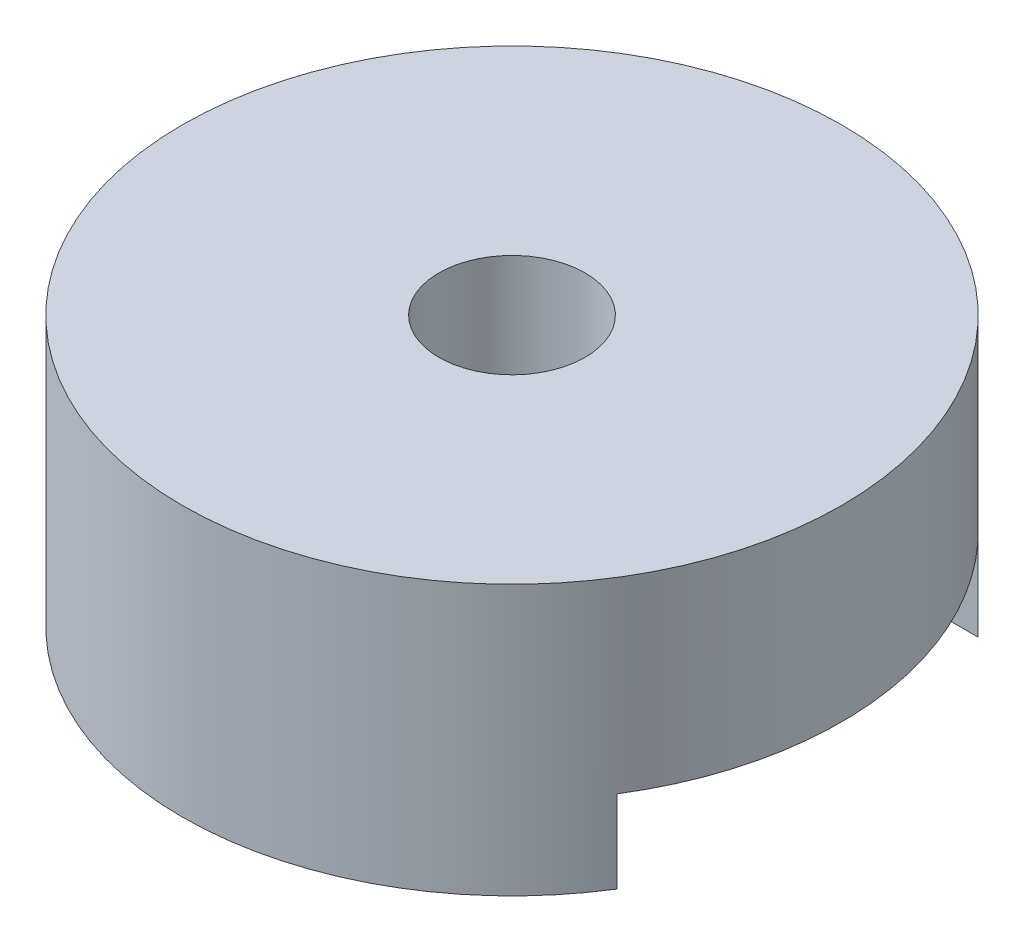
ISO-10303-21;
HEADER;
FILE_DESCRIPTION(('STEP AP214'),'2;1');
FILE_NAME('part.step','',(''),(''),'','','');
FILE_SCHEMA(('AUTOMOTIVE_DESIGN { 1 0 10303 214 1 1 1 1 }'));
ENDSEC;
DATA;
#1=APPLICATION_CONTEXT('core data for automotive mechanical design processes');
#2=APPLICATION_PROTOCOL_DEFINITION('international standard','automotive_design',2000,#1);
#3=PRODUCT_CONTEXT('',#1,'mechanical');
#4=PRODUCT('Part','Part','',(#3));
#5=PRODUCT_RELATED_PRODUCT_CATEGORY('part','',(#4));
#6=PRODUCT_DEFINITION_FORMATION('','',#4);
#7=PRODUCT_DEFINITION_CONTEXT('part definition',#1,'design');
#8=PRODUCT_DEFINITION('design','',#6,#7);
#9=PRODUCT_DEFINITION_SHAPE('','',#8);
#10=(LENGTH_UNIT() NAMED_UNIT(*) SI_UNIT(.MILLI.,.METRE.));
#11=(NAMED_UNIT(*) PLANE_ANGLE_UNIT() SI_UNIT($,.RADIAN.));
#12=(NAMED_UNIT(*) SI_UNIT($,.STERADIAN.) SOLID_ANGLE_UNIT());
#13=UNCERTAINTY_MEASURE_WITH_UNIT(LENGTH_MEASURE(1.E-05),#10,'distance_accuracy_value','');
#14=(GEOMETRIC_REPRESENTATION_CONTEXT(3) GLOBAL_UNCERTAINTY_ASSIGNED_CONTEXT((#13)) GLOBAL_UNIT_ASSIGNED_CONTEXT((#10,
#11,#12)) REPRESENTATION_CONTEXT('',''));
#15=CARTESIAN_POINT('',(0.,0.,0.));
#16=DIRECTION('',(0.,0.,1.));
#17=DIRECTION('',(1.,0.,0.));
#18=AXIS2_PLACEMENT_3D('',#15,#16,#17);
#19=CARTESIAN_POINT('',(0.,-6.6,0.));
#20=DIRECTION('',(0.,1.,0.));
#21=DIRECTION('',(0.,0.,1.));
#22=AXIS2_PLACEMENT_3D('',#19,#20,#21);
#23=PLANE('',#22);
#24=CARTESIAN_POINT('',(0.,-6.6,14.));
#25=DIRECTION('',(0.,-1.,0.));
#26=DIRECTION('',(0.,0.,-1.));
#27=AXIS2_PLACEMENT_3D('',#24,#25,#26);
#28=CIRCLE('',#27,1.225);
#29=CARTESIAN_POINT('',(0.,-6.6,12.775));
#30=VERTEX_POINT('',#29);
#31=EDGE_CURVE('E245',#30,#30,#28,.T.);
#32=ORIENTED_EDGE('',*,*,#31,.F.);
#33=EDGE_LOOP('',(#32));
#34=FACE_BOUND('',#33,.T.);
#35=DIRECTION('',(1.,0.,0.));
#36=VECTOR('',#35,1.);
#37=CARTESIAN_POINT('',(0.,-6.6,8.475));
#38=LINE('',#37,#36);
#39=CARTESIAN_POINT('',(-11.7360289280489,-6.6,8.475));
#40=VERTEX_POINT('',#39);
#41=CARTESIAN_POINT('',(13.5710859919168,-6.6,8.475));
#42=VERTEX_POINT('',#41);
#43=EDGE_CURVE('E225',#40,#42,#38,.T.);
#44=ORIENTED_EDGE('',*,*,#43,.T.);
#45=CARTESIAN_POINT('',(0.,-6.6,0.));
#46=DIRECTION('',(0.,1.,0.));
#47=DIRECTION('',(0.,0.,1.));
#48=AXIS2_PLACEMENT_3D('',#45,#46,#47);
#49=CIRCLE('',#48,16.);
#50=CARTESIAN_POINT('',(-11.7360289280489,-6.6,10.875));
#51=VERTEX_POINT('',#50);
#52=EDGE_CURVE('E221',#51,#42,#49,.T.);
#53=ORIENTED_EDGE('',*,*,#52,.F.);
#54=DIRECTION('',(0.,0.,-1.));
#55=VECTOR('',#54,1.);
#56=CARTESIAN_POINT('',(-11.7360289280489,-6.6,0.));
#57=LINE('',#56,#55);
#58=EDGE_CURVE('E12',#51,#40,#57,.T.);
#59=ORIENTED_EDGE('',*,*,#58,.T.);
#60=EDGE_LOOP('',(#44,#53,#59));
#61=FACE_BOUND('',#60,.T.);
#62=ADVANCED_FACE('F40',(#34,#61),#23,.F.);
#63=CARTESIAN_POINT('',(0.,-3.,-6.275));
#64=DIRECTION('',(0.,0.,1.));
#65=DIRECTION('',(1.,0.,0.));
#66=AXIS2_PLACEMENT_3D('',#63,#64,#65);
#67=PLANE('',#66);
#68=DIRECTION('',(1.,0.,0.));
#69=VECTOR('',#68,1.);
#70=CARTESIAN_POINT('',(0.,0.,-6.275));
#71=LINE('',#70,#69);
#72=CARTESIAN_POINT('',(-6.1,0.,-6.275));
#73=VERTEX_POINT('',#72);
#74=CARTESIAN_POINT('',(6.1,0.,-6.275));
#75=VERTEX_POINT('',#74);
#76=EDGE_CURVE('E139',#73,#75,#71,.T.);
#77=ORIENTED_EDGE('',*,*,#76,.F.);
#78=DIRECTION('',(0.,1.,0.));
#79=VECTOR('',#78,1.);
#80=CARTESIAN_POINT('',(-6.1,-3.,-6.275));
#81=LINE('',#80,#79);
#82=CARTESIAN_POINT('',(-6.1,-3.,-6.275));
#83=VERTEX_POINT('',#82);
#84=EDGE_CURVE('E48',#83,#73,#81,.T.);
#85=ORIENTED_EDGE('',*,*,#84,.F.);
#86=DIRECTION('',(1.,0.,0.));
#87=VECTOR('',#86,1.);
#88=CARTESIAN_POINT('',(0.,-3.,-6.275));
#89=LINE('',#88,#87);
#90=CARTESIAN_POINT('',(6.1,-3.,-6.275));
#91=VERTEX_POINT('',#90);
#92=EDGE_CURVE('E110',#83,#91,#89,.T.);
#93=ORIENTED_EDGE('',*,*,#92,.T.);
#94=DIRECTION('',(0.,1.,0.));
#95=VECTOR('',#94,1.);
#96=CARTESIAN_POINT('',(6.1,-3.,-6.275));
#97=LINE('',#96,#95);
#98=EDGE_CURVE('E138',#91,#75,#97,.T.);
#99=ORIENTED_EDGE('',*,*,#98,.T.);
#100=EDGE_LOOP('',(#77,#85,#93,#99));
#101=FACE_BOUND('',#100,.T.);
#102=ADVANCED_FACE('F42',(#101),#67,.T.);
#103=CARTESIAN_POINT('',(-6.1,-3.,0.));
#104=DIRECTION('',(-1.,0.,0.));
#105=DIRECTION('',(0.,0.,1.));
#106=AXIS2_PLACEMENT_3D('',#103,#104,#105);
#107=PLANE('',#106);
#108=DIRECTION('',(0.,0.,1.));
#109=VECTOR('',#108,1.);
#110=CARTESIAN_POINT('',(-6.1,0.,0.));
#111=LINE('',#110,#109);
#112=CARTESIAN_POINT('',(-6.1,0.,6.275));
#113=VERTEX_POINT('',#112);
#114=EDGE_CURVE('E118',#73,#113,#111,.T.);
#115=ORIENTED_EDGE('',*,*,#114,.T.);
#116=DIRECTION('',(0.,1.,0.));
#117=VECTOR('',#116,1.);
#118=CARTESIAN_POINT('',(-6.1,-3.,6.275));
#119=LINE('',#118,#117);
#120=CARTESIAN_POINT('',(-6.1,-3.,6.275));
#121=VERTEX_POINT('',#120);
#122=EDGE_CURVE('E116',#121,#113,#119,.T.);
#123=ORIENTED_EDGE('',*,*,#122,.F.);
#124=DIRECTION('',(0.,0.,1.));
#125=VECTOR('',#124,1.);
#126=CARTESIAN_POINT('',(-6.1,-3.,0.));
#127=LINE('',#126,#125);
#128=EDGE_CURVE('E101',#83,#121,#127,.T.);
#129=ORIENTED_EDGE('',*,*,#128,.F.);
#130=ORIENTED_EDGE('',*,*,#84,.T.);
#131=EDGE_LOOP('',(#115,#123,#129,#130));
#132=FACE_BOUND('',#131,.T.);
#133=ADVANCED_FACE('F117',(#132),#107,.F.);
#134=CARTESIAN_POINT('',(0.,-3.,6.275));
#135=DIRECTION('',(0.,0.,1.));
#136=DIRECTION('',(1.,0.,0.));
#137=AXIS2_PLACEMENT_3D('',#134,#135,#136);
#138=PLANE('',#137);
#139=DIRECTION('',(1.,0.,0.));
#140=VECTOR('',#139,1.);
#141=CARTESIAN_POINT('',(0.,0.,6.275));
#142=LINE('',#141,#140);
#143=CARTESIAN_POINT('',(6.1,0.,6.275));
#144=VERTEX_POINT('',#143);
#145=EDGE_CURVE('E77',#113,#144,#142,.T.);
#146=ORIENTED_EDGE('',*,*,#145,.T.);
#147=DIRECTION('',(0.,1.,0.));
#148=VECTOR('',#147,1.);
#149=CARTESIAN_POINT('',(6.1,-3.,6.275));
#150=LINE('',#149,#148);
#151=CARTESIAN_POINT('',(6.1,-3.,6.275));
#152=VERTEX_POINT('',#151);
#153=EDGE_CURVE('E120',#152,#144,#150,.T.);
#154=ORIENTED_EDGE('',*,*,#153,.F.);
#155=DIRECTION('',(1.,0.,0.));
#156=VECTOR('',#155,1.);
#157=CARTESIAN_POINT('',(0.,-3.,6.275));
#158=LINE('',#157,#156);
#159=EDGE_CURVE('E107',#121,#152,#158,.T.);
#160=ORIENTED_EDGE('',*,*,#159,.F.);
#161=ORIENTED_EDGE('',*,*,#122,.T.);
#162=EDGE_LOOP('',(#146,#154,#160,#161));
#163=FACE_BOUND('',#162,.T.);
#164=ADVANCED_FACE('F122',(#163),#138,.F.);
#165=CARTESIAN_POINT('',(6.1,-3.,0.));
#166=DIRECTION('',(-1.,0.,0.));
#167=DIRECTION('',(0.,0.,1.));
#168=AXIS2_PLACEMENT_3D('',#165,#166,#167);
#169=PLANE('',#168);
#170=DIRECTION('',(0.,0.,1.));
#171=VECTOR('',#170,1.);
#172=CARTESIAN_POINT('',(6.1,0.,0.));
#173=LINE('',#172,#171);
#174=EDGE_CURVE('E142',#75,#144,#173,.T.);
#175=ORIENTED_EDGE('',*,*,#174,.F.);
#176=ORIENTED_EDGE('',*,*,#98,.F.);
#177=DIRECTION('',(0.,0.,1.));
#178=VECTOR('',#177,1.);
#179=CARTESIAN_POINT('',(6.1,-3.,0.));
#180=LINE('',#179,#178);
#181=EDGE_CURVE('E125',#91,#152,#180,.T.);
#182=ORIENTED_EDGE('',*,*,#181,.T.);
#183=ORIENTED_EDGE('',*,*,#153,.T.);
#184=EDGE_LOOP('',(#175,#176,#182,#183));
#185=FACE_BOUND('',#184,.T.);
#186=ADVANCED_FACE('F158',(#185),#169,.T.);
#187=CARTESIAN_POINT('',(0.,-3.,0.));
#188=DIRECTION('',(0.,1.,0.));
#189=DIRECTION('',(0.,0.,1.));
#190=AXIS2_PLACEMENT_3D('',#187,#188,#189);
#191=PLANE('',#190);
#192=ORIENTED_EDGE('',*,*,#92,.F.);
#193=ORIENTED_EDGE('',*,*,#128,.T.);
#194=ORIENTED_EDGE('',*,*,#159,.T.);
#195=ORIENTED_EDGE('',*,*,#181,.F.);
#196=EDGE_LOOP('',(#192,#193,#194,#195));
#197=FACE_BOUND('',#196,.T.);
#198=DIRECTION('',(1.,0.,0.));
#199=VECTOR('',#198,1.);
#200=CARTESIAN_POINT('',(0.,-3.,-8.075));
#201=LINE('',#200,#199);
#202=CARTESIAN_POINT('',(-7.9,-3.,-8.075));
#203=VERTEX_POINT('',#202);
#204=CARTESIAN_POINT('',(7.9,-3.,-8.075));
#205=VERTEX_POINT('',#204);
#206=EDGE_CURVE('E113',#203,#205,#201,.T.);
#207=ORIENTED_EDGE('',*,*,#206,.T.);
#208=DIRECTION('',(0.,0.,1.));
#209=VECTOR('',#208,1.);
#210=CARTESIAN_POINT('',(7.9,-3.,0.));
#211=LINE('',#210,#209);
#212=CARTESIAN_POINT('',(7.9,-3.,8.075));
#213=VERTEX_POINT('',#212);
#214=EDGE_CURVE('E135',#205,#213,#211,.T.);
#215=ORIENTED_EDGE('',*,*,#214,.T.);
#216=DIRECTION('',(1.,0.,0.));
#217=VECTOR('',#216,1.);
#218=CARTESIAN_POINT('',(0.,-3.,8.075));
#219=LINE('',#218,#217);
#220=CARTESIAN_POINT('',(-7.9,-3.,8.075));
#221=VERTEX_POINT('',#220);
#222=EDGE_CURVE('E133',#221,#213,#219,.T.);
#223=ORIENTED_EDGE('',*,*,#222,.F.);
#224=DIRECTION('',(0.,0.,1.));
#225=VECTOR('',#224,1.);
#226=CARTESIAN_POINT('',(-7.9,-3.,0.));
#227=LINE('',#226,#225);
#228=EDGE_CURVE('E89',#203,#221,#227,.T.);
#229=ORIENTED_EDGE('',*,*,#228,.F.);
#230=EDGE_LOOP('',(#207,#215,#223,#229));
#231=FACE_BOUND('',#230,.T.);
#232=ADVANCED_FACE('F103',(#197,#231),#191,.F.);
#233=CARTESIAN_POINT('',(-7.9,-5.,0.));
#234=DIRECTION('',(-1.,0.,0.));
#235=DIRECTION('',(0.,0.,1.));
#236=AXIS2_PLACEMENT_3D('',#233,#234,#235);
#237=PLANE('',#236);
#238=DIRECTION('',(0.,1.,0.));
#239=VECTOR('',#238,1.);
#240=CARTESIAN_POINT('',(-7.9,-5.,-8.075));
#241=LINE('',#240,#239);
#242=CARTESIAN_POINT('',(-7.9,-5.,-8.075));
#243=VERTEX_POINT('',#242);
#244=EDGE_CURVE('E178',#243,#203,#241,.T.);
#245=ORIENTED_EDGE('',*,*,#244,.T.);
#246=ORIENTED_EDGE('',*,*,#228,.T.);
#247=DIRECTION('',(0.,1.,0.));
#248=VECTOR('',#247,1.);
#249=CARTESIAN_POINT('',(-7.9,-5.,8.075));
#250=LINE('',#249,#248);
#251=CARTESIAN_POINT('',(-7.9,-5.,8.075));
#252=VERTEX_POINT('',#251);
#253=EDGE_CURVE('E143',#252,#221,#250,.T.);
#254=ORIENTED_EDGE('',*,*,#253,.F.);
#255=DIRECTION('',(0.,0.,1.));
#256=VECTOR('',#255,1.);
#257=CARTESIAN_POINT('',(-7.9,-5.,0.));
#258=LINE('',#257,#256);
#259=EDGE_CURVE('E182',#243,#252,#258,.T.);
#260=ORIENTED_EDGE('',*,*,#259,.F.);
#261=EDGE_LOOP('',(#245,#246,#254,#260));
#262=FACE_BOUND('',#261,.T.);
#263=ADVANCED_FACE('F180',(#262),#237,.F.);
#264=CARTESIAN_POINT('',(0.,-5.,8.075));
#265=DIRECTION('',(0.,0.,1.));
#266=DIRECTION('',(1.,0.,0.));
#267=AXIS2_PLACEMENT_3D('',#264,#265,#266);
#268=PLANE('',#267);
#269=ORIENTED_EDGE('',*,*,#253,.T.);
#270=ORIENTED_EDGE('',*,*,#222,.T.);
#271=DIRECTION('',(0.,1.,0.));
#272=VECTOR('',#271,1.);
#273=CARTESIAN_POINT('',(7.9,-5.,8.075));
#274=LINE('',#273,#272);
#275=CARTESIAN_POINT('',(7.9,-5.,8.075));
#276=VERTEX_POINT('',#275);
#277=EDGE_CURVE('E191',#276,#213,#274,.T.);
#278=ORIENTED_EDGE('',*,*,#277,.F.);
#279=DIRECTION('',(1.,0.,0.));
#280=VECTOR('',#279,1.);
#281=CARTESIAN_POINT('',(0.,-5.,8.075));
#282=LINE('',#281,#280);
#283=EDGE_CURVE('E209',#252,#276,#282,.T.);
#284=ORIENTED_EDGE('',*,*,#283,.F.);
#285=EDGE_LOOP('',(#269,#270,#278,#284));
#286=FACE_BOUND('',#285,.T.);
#287=ADVANCED_FACE('F190',(#286),#268,.F.);
#288=CARTESIAN_POINT('',(7.9,-5.,0.));
#289=DIRECTION('',(-1.,0.,0.));
#290=DIRECTION('',(0.,0.,1.));
#291=AXIS2_PLACEMENT_3D('',#288,#289,#290);
#292=PLANE('',#291);
#293=ORIENTED_EDGE('',*,*,#214,.F.);
#294=DIRECTION('',(0.,1.,0.));
#295=VECTOR('',#294,1.);
#296=CARTESIAN_POINT('',(7.9,-5.,-8.075));
#297=LINE('',#296,#295);
#298=CARTESIAN_POINT('',(7.9,-5.,-8.075));
#299=VERTEX_POINT('',#298);
#300=EDGE_CURVE('E63',#299,#205,#297,.T.);
#301=ORIENTED_EDGE('',*,*,#300,.F.);
#302=DIRECTION('',(0.,0.,1.));
#303=VECTOR('',#302,1.);
#304=CARTESIAN_POINT('',(7.9,-5.,0.));
#305=LINE('',#304,#303);
#306=EDGE_CURVE('E196',#299,#276,#305,.T.);
#307=ORIENTED_EDGE('',*,*,#306,.T.);
#308=ORIENTED_EDGE('',*,*,#277,.T.);
#309=EDGE_LOOP('',(#293,#301,#307,#308));
#310=FACE_BOUND('',#309,.T.);
#311=ADVANCED_FACE('F194',(#310),#292,.T.);
#312=CARTESIAN_POINT('',(0.,-5.,-8.075));
#313=DIRECTION('',(0.,0.,1.));
#314=DIRECTION('',(1.,0.,0.));
#315=AXIS2_PLACEMENT_3D('',#312,#313,#314);
#316=PLANE('',#315);
#317=ORIENTED_EDGE('',*,*,#206,.F.);
#318=ORIENTED_EDGE('',*,*,#244,.F.);
#319=DIRECTION('',(1.,0.,0.));
#320=VECTOR('',#319,1.);
#321=CARTESIAN_POINT('',(0.,-5.,-8.075));
#322=LINE('',#321,#320);
#323=EDGE_CURVE('E212',#243,#299,#322,.T.);
#324=ORIENTED_EDGE('',*,*,#323,.T.);
#325=ORIENTED_EDGE('',*,*,#300,.T.);
#326=EDGE_LOOP('',(#317,#318,#324,#325));
#327=FACE_BOUND('',#326,.T.);
#328=ADVANCED_FACE('F177',(#327),#316,.T.);
#329=CARTESIAN_POINT('',(0.,-5.,0.));
#330=DIRECTION('',(0.,1.,0.));
#331=DIRECTION('',(0.,0.,1.));
#332=AXIS2_PLACEMENT_3D('',#329,#330,#331);
#333=CYLINDRICAL_SURFACE('',#332,16.);
#334=DIRECTION('',(0.,-1.,0.));
#335=VECTOR('',#334,1.);
#336=CARTESIAN_POINT('',(13.5710859919168,-2.6,8.475));
#337=LINE('',#336,#335);
#338=CARTESIAN_POINT('',(13.5710859919168,-2.6,8.475));
#339=VERTEX_POINT('',#338);
#340=EDGE_CURVE('E273',#339,#42,#337,.T.);
#341=ORIENTED_EDGE('',*,*,#340,.F.);
#342=CARTESIAN_POINT('',(0.,-2.6,0.));
#343=DIRECTION('',(0.,-1.,0.));
#344=DIRECTION('',(0.,0.,-1.));
#345=AXIS2_PLACEMENT_3D('',#342,#343,#344);
#346=CIRCLE('',#345,16.);
#347=CARTESIAN_POINT('',(11.7360289280489,-2.6,-10.875));
#348=VERTEX_POINT('',#347);
#349=EDGE_CURVE('E280',#348,#339,#346,.T.);
#350=ORIENTED_EDGE('',*,*,#349,.F.);
#351=DIRECTION('',(0.,-1.,0.));
#352=VECTOR('',#351,1.);
#353=CARTESIAN_POINT('',(11.7360289280489,-2.6,-10.875));
#354=LINE('',#353,#352);
#355=CARTESIAN_POINT('',(11.7360289280489,-6.6,-10.875));
#356=VERTEX_POINT('',#355);
#357=EDGE_CURVE('E269',#348,#356,#354,.T.);
#358=ORIENTED_EDGE('',*,*,#357,.T.);
#359=CARTESIAN_POINT('',(-11.7360289280489,-6.6,-10.875));
#360=VERTEX_POINT('',#359);
#361=EDGE_CURVE('E224',#356,#360,#49,.T.);
#362=ORIENTED_EDGE('',*,*,#361,.T.);
#363=DIRECTION('',(0.,1.,0.));
#364=VECTOR('',#363,1.);
#365=CARTESIAN_POINT('',(-11.7360289280489,-6.6,-10.875));
#366=LINE('',#365,#364);
#367=CARTESIAN_POINT('',(-11.7360289280489,-4.99999999999999,-10.875));
#368=VERTEX_POINT('',#367);
#369=EDGE_CURVE('E215',#360,#368,#366,.T.);
#370=ORIENTED_EDGE('',*,*,#369,.T.);
#371=DIRECTION('',(0.,-1.,0.));
#372=VECTOR('',#371,1.);
#373=CARTESIAN_POINT('',(-11.7360289280489,23.1640237615474,-10.875));
#374=LINE('',#373,#372);
#375=CARTESIAN_POINT('',(-11.7360289280489,-2.,-10.875));
#376=VERTEX_POINT('',#375);
#377=EDGE_CURVE('E253',#376,#368,#374,.T.);
#378=ORIENTED_EDGE('',*,*,#377,.F.);
#379=CARTESIAN_POINT('',(0.,-2.,0.));
#380=DIRECTION('',(0.,1.,0.));
#381=DIRECTION('',(0.,0.,1.));
#382=AXIS2_PLACEMENT_3D('',#379,#380,#381);
#383=CIRCLE('',#382,16.);
#384=CARTESIAN_POINT('',(-11.7360289280489,-1.99999999999999,10.875));
#385=VERTEX_POINT('',#384);
#386=EDGE_CURVE('E256',#385,#376,#383,.F.);
#387=ORIENTED_EDGE('',*,*,#386,.F.);
#388=DIRECTION('',(0.,-1.,0.));
#389=VECTOR('',#388,1.);
#390=CARTESIAN_POINT('',(-11.7360289280489,23.1640237615474,10.875));
#391=LINE('',#390,#389);
#392=EDGE_CURVE('E257',#385,#51,#391,.T.);
#393=ORIENTED_EDGE('',*,*,#392,.T.);
#394=ORIENTED_EDGE('',*,*,#52,.T.);
#395=EDGE_LOOP('',(#341,#350,#358,#362,#370,#378,#387,#393,#394));
#396=FACE_BOUND('',#395,.T.);
#397=CARTESIAN_POINT('',(0.,6.5,0.));
#398=DIRECTION('',(0.,1.,0.));
#399=DIRECTION('',(0.,0.,1.));
#400=AXIS2_PLACEMENT_3D('',#397,#398,#399);
#401=CIRCLE('',#400,16.);
#402=CARTESIAN_POINT('',(0.,6.5,16.));
#403=VERTEX_POINT('',#402);
#404=EDGE_CURVE('E228',#403,#403,#401,.T.);
#405=ORIENTED_EDGE('',*,*,#404,.F.);
#406=EDGE_LOOP('',(#405));
#407=FACE_BOUND('',#406,.T.);
#408=ADVANCED_FACE('F352',(#396,#407),#333,.T.);
#409=CARTESIAN_POINT('',(0.,-5.,0.));
#410=DIRECTION('',(0.,1.,0.));
#411=DIRECTION('',(0.,0.,1.));
#412=AXIS2_PLACEMENT_3D('',#409,#410,#411);
#413=PLANE('',#412);
#414=ORIENTED_EDGE('',*,*,#259,.T.);
#415=ORIENTED_EDGE('',*,*,#283,.T.);
#416=ORIENTED_EDGE('',*,*,#306,.F.);
#417=ORIENTED_EDGE('',*,*,#323,.F.);
#418=EDGE_LOOP('',(#414,#415,#416,#417));
#419=FACE_BOUND('',#418,.T.);
#420=DIRECTION('',(1.,0.,0.));
#421=VECTOR('',#420,1.);
#422=CARTESIAN_POINT('',(0.,-5.,8.475));
#423=LINE('',#422,#421);
#424=CARTESIAN_POINT('',(-11.7360289280489,-5.,8.475));
#425=VERTEX_POINT('',#424);
#426=CARTESIAN_POINT('',(10.7,-5.,8.475));
#427=VERTEX_POINT('',#426);
#428=EDGE_CURVE('E203',#425,#427,#423,.T.);
#429=ORIENTED_EDGE('',*,*,#428,.F.);
#430=DIRECTION('',(0.,0.,-1.));
#431=VECTOR('',#430,1.);
#432=CARTESIAN_POINT('',(-11.7360289280489,-5.,0.));
#433=LINE('',#432,#431);
#434=EDGE_CURVE('E242',#425,#368,#433,.T.);
#435=ORIENTED_EDGE('',*,*,#434,.T.);
#436=DIRECTION('',(1.,0.,0.));
#437=VECTOR('',#436,1.);
#438=CARTESIAN_POINT('',(0.,-5.,-10.875));
#439=LINE('',#438,#437);
#440=CARTESIAN_POINT('',(10.7,-5.,-10.875));
#441=VERTEX_POINT('',#440);
#442=EDGE_CURVE('E206',#368,#441,#439,.T.);
#443=ORIENTED_EDGE('',*,*,#442,.T.);
#444=DIRECTION('',(0.,0.,1.));
#445=VECTOR('',#444,1.);
#446=CARTESIAN_POINT('',(10.7,-5.,0.));
#447=LINE('',#446,#445);
#448=EDGE_CURVE('E184',#441,#427,#447,.T.);
#449=ORIENTED_EDGE('',*,*,#448,.T.);
#450=EDGE_LOOP('',(#429,#435,#443,#449));
#451=FACE_BOUND('',#450,.T.);
#452=ADVANCED_FACE('F361',(#419,#451),#413,.F.);
#453=CARTESIAN_POINT('',(0.,-6.6,8.475));
#454=DIRECTION('',(0.,0.,1.));
#455=DIRECTION('',(1.,0.,0.));
#456=AXIS2_PLACEMENT_3D('',#453,#454,#455);
#457=PLANE('',#456);
#458=ORIENTED_EDGE('',*,*,#43,.F.);
#459=DIRECTION('',(0.,1.,0.));
#460=VECTOR('',#459,1.);
#461=CARTESIAN_POINT('',(-11.7360289280489,-6.6,8.475));
#462=LINE('',#461,#460);
#463=EDGE_CURVE('E55',#40,#425,#462,.T.);
#464=ORIENTED_EDGE('',*,*,#463,.T.);
#465=ORIENTED_EDGE('',*,*,#428,.T.);
#466=DIRECTION('',(0.,-1.,0.));
#467=VECTOR('',#466,1.);
#468=CARTESIAN_POINT('',(10.7,-2.6,8.475));
#469=LINE('',#468,#467);
#470=CARTESIAN_POINT('',(10.7,-2.6,8.475));
#471=VERTEX_POINT('',#470);
#472=EDGE_CURVE('E265',#471,#427,#469,.T.);
#473=ORIENTED_EDGE('',*,*,#472,.F.);
#474=DIRECTION('',(-1.,0.,0.));
#475=VECTOR('',#474,1.);
#476=CARTESIAN_POINT('',(10.7,-2.6,8.475));
#477=LINE('',#476,#475);
#478=EDGE_CURVE('E270',#339,#471,#477,.T.);
#479=ORIENTED_EDGE('',*,*,#478,.F.);
#480=ORIENTED_EDGE('',*,*,#340,.T.);
#481=EDGE_LOOP('',(#458,#464,#465,#473,#479,#480));
#482=FACE_BOUND('',#481,.T.);
#483=ADVANCED_FACE('F395',(#482),#457,.F.);
#484=CARTESIAN_POINT('',(0.,-6.6,-10.875));
#485=DIRECTION('',(0.,0.,1.));
#486=DIRECTION('',(1.,0.,0.));
#487=AXIS2_PLACEMENT_3D('',#484,#485,#486);
#488=PLANE('',#487);
#489=ORIENTED_EDGE('',*,*,#442,.F.);
#490=ORIENTED_EDGE('',*,*,#369,.F.);
#491=DIRECTION('',(1.,0.,0.));
#492=VECTOR('',#491,1.);
#493=CARTESIAN_POINT('',(0.,-6.6,-10.875));
#494=LINE('',#493,#492);
#495=EDGE_CURVE('E218',#360,#356,#494,.T.);
#496=ORIENTED_EDGE('',*,*,#495,.T.);
#497=ORIENTED_EDGE('',*,*,#357,.F.);
#498=DIRECTION('',(1.,0.,0.));
#499=VECTOR('',#498,1.);
#500=CARTESIAN_POINT('',(10.7,-2.6,-10.875));
#501=LINE('',#500,#499);
#502=CARTESIAN_POINT('',(10.7,-2.6,-10.875));
#503=VERTEX_POINT('',#502);
#504=EDGE_CURVE('E283',#503,#348,#501,.T.);
#505=ORIENTED_EDGE('',*,*,#504,.F.);
#506=DIRECTION('',(0.,-1.,0.));
#507=VECTOR('',#506,1.);
#508=CARTESIAN_POINT('',(10.7,-2.6,-10.875));
#509=LINE('',#508,#507);
#510=EDGE_CURVE('E266',#503,#441,#509,.T.);
#511=ORIENTED_EDGE('',*,*,#510,.T.);
#512=EDGE_LOOP('',(#489,#490,#496,#497,#505,#511));
#513=FACE_BOUND('',#512,.T.);
#514=ADVANCED_FACE('F364',(#513),#488,.T.);
#515=CARTESIAN_POINT('',(0.,-6.6,-14.));
#516=DIRECTION('',(0.,-1.,0.));
#517=DIRECTION('',(0.,0.,-1.));
#518=AXIS2_PLACEMENT_3D('',#515,#516,#517);
#519=CIRCLE('',#518,1.225);
#520=CARTESIAN_POINT('',(0.,-6.6,-15.225));
#521=VERTEX_POINT('',#520);
#522=EDGE_CURVE('E238',#521,#521,#519,.T.);
#523=ORIENTED_EDGE('',*,*,#522,.F.);
#524=EDGE_LOOP('',(#523));
#525=FACE_BOUND('',#524,.T.);
#526=ORIENTED_EDGE('',*,*,#361,.F.);
#527=ORIENTED_EDGE('',*,*,#495,.F.);
#528=EDGE_LOOP('',(#526,#527));
#529=FACE_BOUND('',#528,.T.);
#530=ADVANCED_FACE('F414',(#525,#529),#23,.F.);
#531=CARTESIAN_POINT('',(0.,0.,0.));
#532=DIRECTION('',(0.,1.,0.));
#533=DIRECTION('',(0.,0.,1.));
#534=AXIS2_PLACEMENT_3D('',#531,#532,#533);
#535=PLANE('',#534);
#536=CARTESIAN_POINT('',(0.,0.,0.));
#537=DIRECTION('',(0.,1.,0.));
#538=DIRECTION('',(0.,0.,1.));
#539=AXIS2_PLACEMENT_3D('',#536,#537,#538);
#540=CIRCLE('',#539,3.55);
#541=CARTESIAN_POINT('',(0.,0.,-3.55));
#542=VERTEX_POINT('',#541);
#543=EDGE_CURVE('E229',#542,#542,#540,.T.);
#544=ORIENTED_EDGE('',*,*,#543,.T.);
#545=EDGE_LOOP('',(#544));
#546=FACE_BOUND('',#545,.T.);
#547=ORIENTED_EDGE('',*,*,#114,.F.);
#548=ORIENTED_EDGE('',*,*,#76,.T.);
#549=ORIENTED_EDGE('',*,*,#174,.T.);
#550=ORIENTED_EDGE('',*,*,#145,.F.);
#551=EDGE_LOOP('',(#547,#548,#549,#550));
#552=FACE_BOUND('',#551,.T.);
#553=ADVANCED_FACE('F159',(#546,#552),#535,.F.);
#554=CARTESIAN_POINT('',(0.,6.5,0.));
#555=DIRECTION('',(0.,-1.,0.));
#556=DIRECTION('',(0.,0.,-1.));
#557=AXIS2_PLACEMENT_3D('',#554,#555,#556);
#558=CYLINDRICAL_SURFACE('',#557,3.55);
#559=CARTESIAN_POINT('',(0.,6.5,0.));
#560=DIRECTION('',(0.,1.,0.));
#561=DIRECTION('',(0.,0.,1.));
#562=AXIS2_PLACEMENT_3D('',#559,#560,#561);
#563=CIRCLE('',#562,3.55);
#564=CARTESIAN_POINT('',(0.,6.5,-3.55));
#565=VERTEX_POINT('',#564);
#566=EDGE_CURVE('E232',#565,#565,#563,.T.);
#567=CARTESIAN_POINT('',(0.,6.5,-3.55));
#568=CARTESIAN_POINT('',(0.,6.43229166666667,-3.55));
#569=CARTESIAN_POINT('',(0.,6.36458333333333,-3.55));
#570=CARTESIAN_POINT('',(0.,6.22916666666667,-3.55));
#571=CARTESIAN_POINT('',(0.,6.16145833333333,-3.55));
#572=CARTESIAN_POINT('',(0.,6.02604166666667,-3.55));
#573=CARTESIAN_POINT('',(0.,5.95833333333333,-3.55));
#574=CARTESIAN_POINT('',(0.,5.82291666666667,-3.55));
#575=CARTESIAN_POINT('',(0.,5.75520833333333,-3.55));
#576=CARTESIAN_POINT('',(0.,5.61979166666667,-3.55));
#577=CARTESIAN_POINT('',(0.,5.55208333333333,-3.55));
#578=CARTESIAN_POINT('',(0.,5.41666666666667,-3.55));
#579=CARTESIAN_POINT('',(0.,5.34895833333333,-3.55));
#580=CARTESIAN_POINT('',(0.,5.21354166666667,-3.55));
#581=CARTESIAN_POINT('',(0.,5.14583333333333,-3.55));
#582=CARTESIAN_POINT('',(0.,5.01041666666667,-3.55));
#583=CARTESIAN_POINT('',(0.,4.94270833333333,-3.55));
#584=CARTESIAN_POINT('',(0.,4.80729166666667,-3.55));
#585=CARTESIAN_POINT('',(0.,4.73958333333333,-3.55));
#586=CARTESIAN_POINT('',(0.,4.60416666666667,-3.55));
#587=CARTESIAN_POINT('',(0.,4.53645833333333,-3.55));
#588=CARTESIAN_POINT('',(0.,4.40104166666667,-3.55));
#589=CARTESIAN_POINT('',(0.,4.33333333333333,-3.55));
#590=CARTESIAN_POINT('',(0.,4.19791666666667,-3.55));
#591=CARTESIAN_POINT('',(0.,4.13020833333333,-3.55));
#592=CARTESIAN_POINT('',(0.,3.99479166666667,-3.55));
#593=CARTESIAN_POINT('',(0.,3.92708333333333,-3.55));
#594=CARTESIAN_POINT('',(0.,3.79166666666667,-3.55));
#595=CARTESIAN_POINT('',(0.,3.72395833333333,-3.55));
#596=CARTESIAN_POINT('',(0.,3.58854166666667,-3.55));
#597=CARTESIAN_POINT('',(0.,3.52083333333333,-3.55));
#598=CARTESIAN_POINT('',(0.,3.38541666666667,-3.55));
#599=CARTESIAN_POINT('',(0.,3.31770833333333,-3.55));
#600=CARTESIAN_POINT('',(0.,3.18229166666667,-3.55));
#601=CARTESIAN_POINT('',(0.,3.11458333333333,-3.55));
#602=CARTESIAN_POINT('',(0.,2.97916666666667,-3.55));
#603=CARTESIAN_POINT('',(0.,2.91145833333333,-3.55));
#604=CARTESIAN_POINT('',(0.,2.77604166666667,-3.55));
#605=CARTESIAN_POINT('',(0.,2.70833333333333,-3.55));
#606=CARTESIAN_POINT('',(0.,2.57291666666667,-3.55));
#607=CARTESIAN_POINT('',(0.,2.50520833333333,-3.55));
#608=CARTESIAN_POINT('',(0.,2.36979166666667,-3.55));
#609=CARTESIAN_POINT('',(0.,2.30208333333333,-3.55));
#610=CARTESIAN_POINT('',(0.,2.16666666666667,-3.55));
#611=CARTESIAN_POINT('',(0.,2.09895833333333,-3.55));
#612=CARTESIAN_POINT('',(0.,1.96354166666667,-3.55));
#613=CARTESIAN_POINT('',(0.,1.89583333333333,-3.55));
#614=CARTESIAN_POINT('',(0.,1.76041666666667,-3.55));
#615=CARTESIAN_POINT('',(0.,1.69270833333333,-3.55));
#616=CARTESIAN_POINT('',(0.,1.55729166666667,-3.55));
#617=CARTESIAN_POINT('',(0.,1.48958333333333,-3.55));
#618=CARTESIAN_POINT('',(0.,1.35416666666667,-3.55));
#619=CARTESIAN_POINT('',(0.,1.28645833333333,-3.55));
#620=CARTESIAN_POINT('',(0.,1.15104166666667,-3.55));
#621=CARTESIAN_POINT('',(0.,1.08333333333333,-3.55));
#622=CARTESIAN_POINT('',(0.,0.947916666666667,-3.55));
#623=CARTESIAN_POINT('',(0.,0.880208333333333,-3.55));
#624=CARTESIAN_POINT('',(0.,0.744791666666667,-3.55));
#625=CARTESIAN_POINT('',(0.,0.677083333333333,-3.55));
#626=CARTESIAN_POINT('',(0.,0.541666666666667,-3.55));
#627=CARTESIAN_POINT('',(0.,0.473958333333333,-3.55));
#628=CARTESIAN_POINT('',(0.,0.338541666666667,-3.55));
#629=CARTESIAN_POINT('',(0.,0.270833333333334,-3.55));
#630=CARTESIAN_POINT('',(0.,0.135416666666667,-3.55));
#631=CARTESIAN_POINT('',(0.,0.0677083333333334,-3.55));
#632=CARTESIAN_POINT('',(0.,0.,-3.55));
#633=B_SPLINE_CURVE_WITH_KNOTS('',3,(#567,#568,#569,#570,#571,#572,#573,#574,#575,#576,#577,
#578,#579,#580,#581,#582,#583,#584,#585,#586,#587,#588,#589,#590,#591,#592,#593,#594,#595,#596,
#597,#598,#599,#600,#601,#602,#603,#604,#605,#606,#607,#608,#609,#610,#611,#612,#613,#614,#615,
#616,#617,#618,#619,#620,#621,#622,#623,#624,#625,#626,#627,#628,#629,#630,#631,#632),
.UNSPECIFIED.,.F.,.F.,(4,2,2,2,2,2,2,2,2,2,2,2,2,2,2,2,2,2,2,2,2,2,2,2,2,2,2,2,2,2,2,2,4),(0.,
0.203124999999999,0.40625,0.609375,0.812499999999999,1.015625,1.21875,1.421875,1.625,1.828125,
2.03125,2.234375,2.4375,2.640625,2.84375,3.046875,3.25,3.453125,3.65625,3.859375,4.0625,
4.265625,4.46875,4.671875,4.875,5.078125,5.28125,5.484375,5.6875,5.890625,6.09375,6.296875,6.5),.UNSPECIFIED.);
#634=EDGE_CURVE('BSEAM427',#565,#542,#633,.T.);
#635=ORIENTED_EDGE('',*,*,#566,.T.);
#636=ORIENTED_EDGE('',*,*,#543,.F.);
#637=ORIENTED_EDGE('',*,*,#634,.T.);
#638=ORIENTED_EDGE('',*,*,#634,.F.);
#639=EDGE_LOOP('',(#635,#637,#636,#638));
#640=FACE_BOUND('',#639,.T.);
#641=ADVANCED_FACE('F427',(#640),#558,.F.);
#642=CARTESIAN_POINT('',(0.,6.5,0.));
#643=DIRECTION('',(0.,1.,0.));
#644=DIRECTION('',(0.,0.,1.));
#645=AXIS2_PLACEMENT_3D('',#642,#643,#644);
#646=PLANE('',#645);
#647=ORIENTED_EDGE('',*,*,#566,.F.);
#648=EDGE_LOOP('',(#647));
#649=FACE_BOUND('',#648,.T.);
#650=ORIENTED_EDGE('',*,*,#404,.T.);
#651=EDGE_LOOP('',(#650));
#652=FACE_BOUND('',#651,.T.);
#653=ADVANCED_FACE('F436',(#649,#652),#646,.T.);
#654=CARTESIAN_POINT('',(0.,5.4,-14.));
#655=DIRECTION('',(0.,-1.,0.));
#656=DIRECTION('',(0.,0.,-1.));
#657=AXIS2_PLACEMENT_3D('',#654,#655,#656);
#658=CYLINDRICAL_SURFACE('',#657,1.225);
#659=CARTESIAN_POINT('',(0.,5.4,-14.));
#660=DIRECTION('',(0.,-1.,0.));
#661=DIRECTION('',(0.,0.,-1.));
#662=AXIS2_PLACEMENT_3D('',#659,#660,#661);
#663=CIRCLE('',#662,1.225);
#664=CARTESIAN_POINT('',(0.,5.4,-15.225));
#665=VERTEX_POINT('',#664);
#666=EDGE_CURVE('E241',#665,#665,#663,.T.);
#667=ORIENTED_EDGE('',*,*,#666,.F.);
#668=EDGE_LOOP('',(#667));
#669=FACE_BOUND('',#668,.T.);
#670=ORIENTED_EDGE('',*,*,#522,.T.);
#671=EDGE_LOOP('',(#670));
#672=FACE_BOUND('',#671,.T.);
#673=ADVANCED_FACE('F433',(#669,#672),#658,.F.);
#674=CARTESIAN_POINT('',(0.,5.4,-14.));
#675=DIRECTION('',(0.,-1.,0.));
#676=DIRECTION('',(0.,0.,-1.));
#677=AXIS2_PLACEMENT_3D('',#674,#675,#676);
#678=PLANE('',#677);
#679=ORIENTED_EDGE('',*,*,#666,.T.);
#680=EDGE_LOOP('',(#679));
#681=FACE_BOUND('',#680,.T.);
#682=ADVANCED_FACE('F435',(#681),#678,.T.);
#683=CARTESIAN_POINT('',(0.,5.4,14.));
#684=DIRECTION('',(0.,-1.,0.));
#685=DIRECTION('',(0.,0.,-1.));
#686=AXIS2_PLACEMENT_3D('',#683,#684,#685);
#687=CYLINDRICAL_SURFACE('',#686,1.225);
#688=CARTESIAN_POINT('',(0.,5.4,14.));
#689=DIRECTION('',(0.,-1.,0.));
#690=DIRECTION('',(0.,0.,-1.));
#691=AXIS2_PLACEMENT_3D('',#688,#689,#690);
#692=CIRCLE('',#691,1.225);
#693=CARTESIAN_POINT('',(0.,5.4,12.775));
#694=VERTEX_POINT('',#693);
#695=EDGE_CURVE('E233',#694,#694,#692,.T.);
#696=ORIENTED_EDGE('',*,*,#695,.F.);
#697=EDGE_LOOP('',(#696));
#698=FACE_BOUND('',#697,.T.);
#699=ORIENTED_EDGE('',*,*,#31,.T.);
#700=EDGE_LOOP('',(#699));
#701=FACE_BOUND('',#700,.T.);
#702=ADVANCED_FACE('F443',(#698,#701),#687,.F.);
#703=CARTESIAN_POINT('',(0.,5.4,14.));
#704=DIRECTION('',(0.,-1.,0.));
#705=DIRECTION('',(0.,0.,-1.));
#706=AXIS2_PLACEMENT_3D('',#703,#704,#705);
#707=PLANE('',#706);
#708=ORIENTED_EDGE('',*,*,#695,.T.);
#709=EDGE_LOOP('',(#708));
#710=FACE_BOUND('',#709,.T.);
#711=ADVANCED_FACE('F691',(#710),#707,.T.);
#712=CARTESIAN_POINT('',(-11.7360289280489,23.1640237615474,-10.875));
#713=DIRECTION('',(1.,0.,0.));
#714=DIRECTION('',(0.,0.,-1.));
#715=AXIS2_PLACEMENT_3D('',#712,#713,#714);
#716=PLANE('',#715);
#717=ORIENTED_EDGE('',*,*,#463,.F.);
#718=ORIENTED_EDGE('',*,*,#58,.F.);
#719=ORIENTED_EDGE('',*,*,#392,.F.);
#720=DIRECTION('',(0.,0.,1.));
#721=VECTOR('',#720,1.);
#722=CARTESIAN_POINT('',(-11.7360289280489,-2.,-10.875));
#723=LINE('',#722,#721);
#724=EDGE_CURVE('E260',#376,#385,#723,.T.);
#725=ORIENTED_EDGE('',*,*,#724,.F.);
#726=ORIENTED_EDGE('',*,*,#377,.T.);
#727=ORIENTED_EDGE('',*,*,#434,.F.);
#728=EDGE_LOOP('',(#717,#718,#719,#725,#726,#727));
#729=FACE_BOUND('',#728,.T.);
#730=ADVANCED_FACE('F333',(#729),#716,.F.);
#731=CARTESIAN_POINT('',(0.,-2.,0.));
#732=DIRECTION('',(0.,1.,0.));
#733=DIRECTION('',(0.,0.,1.));
#734=AXIS2_PLACEMENT_3D('',#731,#732,#733);
#735=PLANE('',#734);
#736=CARTESIAN_POINT('',(-13.7360289280489,-2.,5.0411276055282));
#737=DIRECTION('',(0.,-1.,0.));
#738=DIRECTION('',(0.,0.,-1.));
#739=AXIS2_PLACEMENT_3D('',#736,#737,#738);
#740=CIRCLE('',#739,0.500000000000001);
#741=CARTESIAN_POINT('',(-13.7360289280489,-2.,4.5411276055282));
#742=VERTEX_POINT('',#741);
#743=EDGE_CURVE('E314',#742,#742,#740,.T.);
#744=ORIENTED_EDGE('',*,*,#743,.F.);
#745=EDGE_LOOP('',(#744));
#746=FACE_BOUND('',#745,.T.);
#747=CARTESIAN_POINT('',(-13.7360289280488,-2.,2.5011276055282));
#748=DIRECTION('',(0.,-1.,0.));
#749=DIRECTION('',(0.,0.,-1.));
#750=AXIS2_PLACEMENT_3D('',#747,#748,#749);
#751=CIRCLE('',#750,0.500000000000001);
#752=CARTESIAN_POINT('',(-13.7360289280488,-2.,2.0011276055282));
#753=VERTEX_POINT('',#752);
#754=EDGE_CURVE('E308',#753,#753,#751,.T.);
#755=ORIENTED_EDGE('',*,*,#754,.F.);
#756=EDGE_LOOP('',(#755));
#757=FACE_BOUND('',#756,.T.);
#758=CARTESIAN_POINT('',(-13.7360289280488,-2.,-0.0388723944718039));
#759=DIRECTION('',(0.,-1.,0.));
#760=DIRECTION('',(0.,0.,-1.));
#761=AXIS2_PLACEMENT_3D('',#758,#759,#760);
#762=CIRCLE('',#761,0.500000000000001);
#763=CARTESIAN_POINT('',(-13.7360289280488,-2.,-0.538872394471805));
#764=VERTEX_POINT('',#763);
#765=EDGE_CURVE('E302',#764,#764,#762,.T.);
#766=ORIENTED_EDGE('',*,*,#765,.F.);
#767=EDGE_LOOP('',(#766));
#768=FACE_BOUND('',#767,.T.);
#769=CARTESIAN_POINT('',(-13.7360289280488,-2.,-2.5788723944718));
#770=DIRECTION('',(0.,-1.,0.));
#771=DIRECTION('',(0.,0.,-1.));
#772=AXIS2_PLACEMENT_3D('',#769,#770,#771);
#773=CIRCLE('',#772,0.500000000000001);
#774=CARTESIAN_POINT('',(-13.7360289280488,-2.,-3.0788723944718));
#775=VERTEX_POINT('',#774);
#776=EDGE_CURVE('E296',#775,#775,#773,.T.);
#777=ORIENTED_EDGE('',*,*,#776,.F.);
#778=EDGE_LOOP('',(#777));
#779=FACE_BOUND('',#778,.T.);
#780=CARTESIAN_POINT('',(-13.7360289280488,-2.,-5.1188723944718));
#781=DIRECTION('',(0.,-1.,0.));
#782=DIRECTION('',(0.,0.,-1.));
#783=AXIS2_PLACEMENT_3D('',#780,#781,#782);
#784=CIRCLE('',#783,0.500000000000001);
#785=CARTESIAN_POINT('',(-13.7360289280488,-2.,-5.6188723944718));
#786=VERTEX_POINT('',#785);
#787=EDGE_CURVE('E290',#786,#786,#784,.T.);
#788=ORIENTED_EDGE('',*,*,#787,.F.);
#789=EDGE_LOOP('',(#788));
#790=FACE_BOUND('',#789,.T.);
#791=ORIENTED_EDGE('',*,*,#386,.T.);
#792=ORIENTED_EDGE('',*,*,#724,.T.);
#793=EDGE_LOOP('',(#791,#792));
#794=FACE_BOUND('',#793,.T.);
#795=ADVANCED_FACE('F329',(#746,#757,#768,#779,#790,#794),#735,.F.);
#796=CARTESIAN_POINT('',(10.7,-2.6,-10.875));
#797=DIRECTION('',(-1.,0.,0.));
#798=DIRECTION('',(0.,0.,1.));
#799=AXIS2_PLACEMENT_3D('',#796,#797,#798);
#800=PLANE('',#799);
#801=ORIENTED_EDGE('',*,*,#510,.F.);
#802=DIRECTION('',(0.,0.,-1.));
#803=VECTOR('',#802,1.);
#804=CARTESIAN_POINT('',(10.7,-2.6,-10.875));
#805=LINE('',#804,#803);
#806=EDGE_CURVE('E286',#471,#503,#805,.T.);
#807=ORIENTED_EDGE('',*,*,#806,.F.);
#808=ORIENTED_EDGE('',*,*,#472,.T.);
#809=ORIENTED_EDGE('',*,*,#448,.F.);
#810=EDGE_LOOP('',(#801,#807,#808,#809));
#811=FACE_BOUND('',#810,.T.);
#812=ADVANCED_FACE('F332',(#811),#800,.F.);
#813=CARTESIAN_POINT('',(0.,-2.6,0.));
#814=DIRECTION('',(0.,-1.,0.));
#815=DIRECTION('',(0.,0.,-1.));
#816=AXIS2_PLACEMENT_3D('',#813,#814,#815);
#817=PLANE('',#816);
#818=ORIENTED_EDGE('',*,*,#806,.T.);
#819=ORIENTED_EDGE('',*,*,#504,.T.);
#820=ORIENTED_EDGE('',*,*,#349,.T.);
#821=ORIENTED_EDGE('',*,*,#478,.T.);
#822=EDGE_LOOP('',(#818,#819,#820,#821));
#823=FACE_BOUND('',#822,.T.);
#824=ADVANCED_FACE('F399',(#823),#817,.T.);
#825=CARTESIAN_POINT('',(-13.7360289280488,-1.6,-5.1188723944718));
#826=DIRECTION('',(0.,-1.,0.));
#827=DIRECTION('',(0.,0.,-1.));
#828=AXIS2_PLACEMENT_3D('',#825,#826,#827);
#829=CYLINDRICAL_SURFACE('',#828,0.500000000000001);
#830=CARTESIAN_POINT('',(-13.7360289280488,-1.6,-5.1188723944718));
#831=DIRECTION('',(0.,-1.,0.));
#832=DIRECTION('',(0.,0.,-1.));
#833=AXIS2_PLACEMENT_3D('',#830,#831,#832);
#834=CIRCLE('',#833,0.500000000000001);
#835=CARTESIAN_POINT('',(-13.7360289280488,-1.6,-5.6188723944718));
#836=VERTEX_POINT('',#835);
#837=EDGE_CURVE('E293',#836,#836,#834,.T.);
#838=ORIENTED_EDGE('',*,*,#837,.F.);
#839=EDGE_LOOP('',(#838));
#840=FACE_BOUND('',#839,.T.);
#841=ORIENTED_EDGE('',*,*,#787,.T.);
#842=EDGE_LOOP('',(#841));
#843=FACE_BOUND('',#842,.T.);
#844=ADVANCED_FACE('F401',(#840,#843),#829,.F.);
#845=CARTESIAN_POINT('',(-13.7360289280488,-1.6,-5.1188723944718));
#846=DIRECTION('',(0.,-1.,0.));
#847=DIRECTION('',(0.,0.,-1.));
#848=AXIS2_PLACEMENT_3D('',#845,#846,#847);
#849=PLANE('',#848);
#850=ORIENTED_EDGE('',*,*,#837,.T.);
#851=EDGE_LOOP('',(#850));
#852=FACE_BOUND('',#851,.T.);
#853=ADVANCED_FACE('F407',(#852),#849,.T.);
#854=CARTESIAN_POINT('',(-13.7360289280488,-1.6,-2.5788723944718));
#855=DIRECTION('',(0.,-1.,0.));
#856=DIRECTION('',(0.,0.,-1.));
#857=AXIS2_PLACEMENT_3D('',#854,#855,#856);
#858=CYLINDRICAL_SURFACE('',#857,0.500000000000001);
#859=CARTESIAN_POINT('',(-13.7360289280488,-1.6,-2.5788723944718));
#860=DIRECTION('',(0.,-1.,0.));
#861=DIRECTION('',(0.,0.,-1.));
#862=AXIS2_PLACEMENT_3D('',#859,#860,#861);
#863=CIRCLE('',#862,0.500000000000001);
#864=CARTESIAN_POINT('',(-13.7360289280488,-1.6,-3.0788723944718));
#865=VERTEX_POINT('',#864);
#866=EDGE_CURVE('E299',#865,#865,#863,.T.);
#867=ORIENTED_EDGE('',*,*,#866,.F.);
#868=EDGE_LOOP('',(#867));
#869=FACE_BOUND('',#868,.T.);
#870=ORIENTED_EDGE('',*,*,#776,.T.);
#871=EDGE_LOOP('',(#870));
#872=FACE_BOUND('',#871,.T.);
#873=ADVANCED_FACE('F603',(#869,#872),#858,.F.);
#874=CARTESIAN_POINT('',(-13.7360289280488,-1.6,-2.5788723944718));
#875=DIRECTION('',(0.,-1.,0.));
#876=DIRECTION('',(0.,0.,-1.));
#877=AXIS2_PLACEMENT_3D('',#874,#875,#876);
#878=PLANE('',#877);
#879=ORIENTED_EDGE('',*,*,#866,.T.);
#880=EDGE_LOOP('',(#879));
#881=FACE_BOUND('',#880,.T.);
#882=ADVANCED_FACE('F613',(#881),#878,.T.);
#883=CARTESIAN_POINT('',(-13.7360289280488,-1.6,-0.0388723944718039));
#884=DIRECTION('',(0.,-1.,0.));
#885=DIRECTION('',(0.,0.,-1.));
#886=AXIS2_PLACEMENT_3D('',#883,#884,#885);
#887=CYLINDRICAL_SURFACE('',#886,0.500000000000001);
#888=CARTESIAN_POINT('',(-13.7360289280488,-1.6,-0.0388723944718039));
#889=DIRECTION('',(0.,-1.,0.));
#890=DIRECTION('',(0.,0.,-1.));
#891=AXIS2_PLACEMENT_3D('',#888,#889,#890);
#892=CIRCLE('',#891,0.500000000000001);
#893=CARTESIAN_POINT('',(-13.7360289280488,-1.6,-0.538872394471805));
#894=VERTEX_POINT('',#893);
#895=EDGE_CURVE('E305',#894,#894,#892,.T.);
#896=ORIENTED_EDGE('',*,*,#895,.F.);
#897=EDGE_LOOP('',(#896));
#898=FACE_BOUND('',#897,.T.);
#899=ORIENTED_EDGE('',*,*,#765,.T.);
#900=EDGE_LOOP('',(#899));
#901=FACE_BOUND('',#900,.T.);
#902=ADVANCED_FACE('F623',(#898,#901),#887,.F.);
#903=CARTESIAN_POINT('',(-13.7360289280488,-1.6,-0.0388723944718039));
#904=DIRECTION('',(0.,-1.,0.));
#905=DIRECTION('',(0.,0.,-1.));
#906=AXIS2_PLACEMENT_3D('',#903,#904,#905);
#907=PLANE('',#906);
#908=ORIENTED_EDGE('',*,*,#895,.T.);
#909=EDGE_LOOP('',(#908));
#910=FACE_BOUND('',#909,.T.);
#911=ADVANCED_FACE('F633',(#910),#907,.T.);
#912=CARTESIAN_POINT('',(-13.7360289280488,-1.6,2.5011276055282));
#913=DIRECTION('',(0.,-1.,0.));
#914=DIRECTION('',(0.,0.,-1.));
#915=AXIS2_PLACEMENT_3D('',#912,#913,#914);
#916=CYLINDRICAL_SURFACE('',#915,0.500000000000001);
#917=CARTESIAN_POINT('',(-13.7360289280488,-1.6,2.5011276055282));
#918=DIRECTION('',(0.,-1.,0.));
#919=DIRECTION('',(0.,0.,-1.));
#920=AXIS2_PLACEMENT_3D('',#917,#918,#919);
#921=CIRCLE('',#920,0.500000000000001);
#922=CARTESIAN_POINT('',(-13.7360289280488,-1.6,2.0011276055282));
#923=VERTEX_POINT('',#922);
#924=EDGE_CURVE('E311',#923,#923,#921,.T.);
#925=ORIENTED_EDGE('',*,*,#924,.F.);
#926=EDGE_LOOP('',(#925));
#927=FACE_BOUND('',#926,.T.);
#928=ORIENTED_EDGE('',*,*,#754,.T.);
#929=EDGE_LOOP('',(#928));
#930=FACE_BOUND('',#929,.T.);
#931=ADVANCED_FACE('F643',(#927,#930),#916,.F.);
#932=CARTESIAN_POINT('',(-13.7360289280488,-1.6,2.5011276055282));
#933=DIRECTION('',(0.,-1.,0.));
#934=DIRECTION('',(0.,0.,-1.));
#935=AXIS2_PLACEMENT_3D('',#932,#933,#934);
#936=PLANE('',#935);
#937=ORIENTED_EDGE('',*,*,#924,.T.);
#938=EDGE_LOOP('',(#937));
#939=FACE_BOUND('',#938,.T.);
#940=ADVANCED_FACE('F325',(#939),#936,.T.);
#941=CARTESIAN_POINT('',(-13.7360289280489,-1.6,5.0411276055282));
#942=DIRECTION('',(0.,-1.,0.));
#943=DIRECTION('',(0.,0.,-1.));
#944=AXIS2_PLACEMENT_3D('',#941,#942,#943);
#945=CYLINDRICAL_SURFACE('',#944,0.500000000000001);
#946=CARTESIAN_POINT('',(-13.7360289280489,-1.6,5.0411276055282));
#947=DIRECTION('',(0.,-1.,0.));
#948=DIRECTION('',(0.,0.,-1.));
#949=AXIS2_PLACEMENT_3D('',#946,#947,#948);
#950=CIRCLE('',#949,0.500000000000001);
#951=CARTESIAN_POINT('',(-13.7360289280489,-1.6,4.5411276055282));
#952=VERTEX_POINT('',#951);
#953=EDGE_CURVE('E289',#952,#952,#950,.T.);
#954=ORIENTED_EDGE('',*,*,#953,.F.);
#955=EDGE_LOOP('',(#954));
#956=FACE_BOUND('',#955,.T.);
#957=ORIENTED_EDGE('',*,*,#743,.T.);
#958=EDGE_LOOP('',(#957));
#959=FACE_BOUND('',#958,.T.);
#960=ADVANCED_FACE('F322',(#956,#959),#945,.F.);
#961=CARTESIAN_POINT('',(-13.7360289280489,-1.6,5.0411276055282));
#962=DIRECTION('',(0.,-1.,0.));
#963=DIRECTION('',(0.,0.,-1.));
#964=AXIS2_PLACEMENT_3D('',#961,#962,#963);
#965=PLANE('',#964);
#966=ORIENTED_EDGE('',*,*,#953,.T.);
#967=EDGE_LOOP('',(#966));
#968=FACE_BOUND('',#967,.T.);
#969=ADVANCED_FACE('F320',(#968),#965,.T.);
#970=CLOSED_SHELL('',(#62,#102,#133,#164,#186,#232,#263,#287,#311,#328,#408,#452,#483,#514,#530,
#553,#641,#653,#673,#682,#702,#711,#730,#795,#812,#824,#844,#853,#873,#882,#902,#911,#931,#940,
#960,#969));
#971=MANIFOLD_SOLID_BREP('B2',#970);
#972=ADVANCED_BREP_SHAPE_REPRESENTATION('',(#18,#971),#14);
#973=SHAPE_DEFINITION_REPRESENTATION(#9,#972);
ENDSEC;
END-ISO-10303-21;
